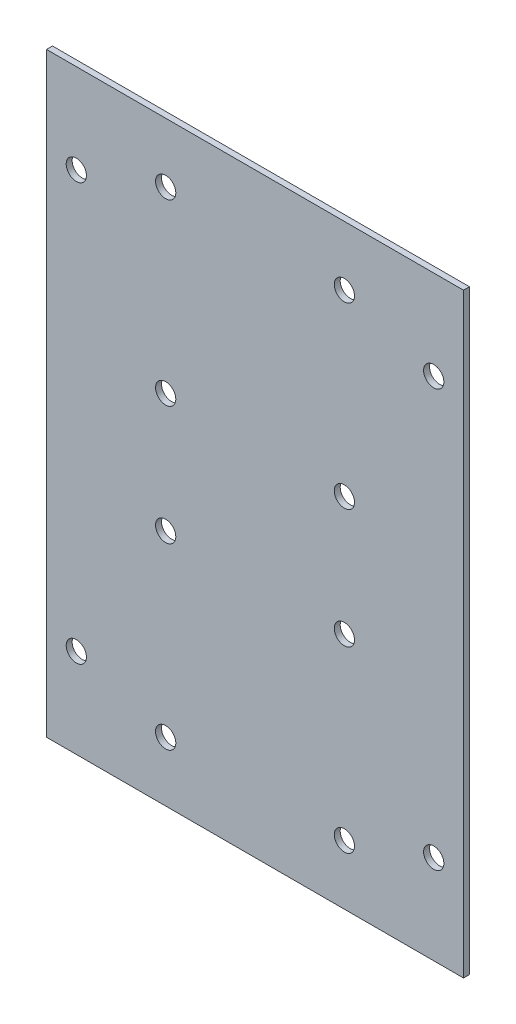
ISO-10303-21;
HEADER;
FILE_DESCRIPTION(('STEP AP214'),'2;1');
FILE_NAME('part.step','',(''),(''),'','','');
FILE_SCHEMA(('AUTOMOTIVE_DESIGN { 1 0 10303 214 1 1 1 1 }'));
ENDSEC;
DATA;
#1=APPLICATION_CONTEXT('core data for automotive mechanical design processes');
#2=APPLICATION_PROTOCOL_DEFINITION('international standard','automotive_design',2000,#1);
#3=PRODUCT_CONTEXT('',#1,'mechanical');
#4=PRODUCT('Part','Part','',(#3));
#5=PRODUCT_RELATED_PRODUCT_CATEGORY('part','',(#4));
#6=PRODUCT_DEFINITION_FORMATION('','',#4);
#7=PRODUCT_DEFINITION_CONTEXT('part definition',#1,'design');
#8=PRODUCT_DEFINITION('design','',#6,#7);
#9=PRODUCT_DEFINITION_SHAPE('','',#8);
#10=(LENGTH_UNIT() NAMED_UNIT(*) SI_UNIT(.MILLI.,.METRE.));
#11=(NAMED_UNIT(*) PLANE_ANGLE_UNIT() SI_UNIT($,.RADIAN.));
#12=(NAMED_UNIT(*) SI_UNIT($,.STERADIAN.) SOLID_ANGLE_UNIT());
#13=UNCERTAINTY_MEASURE_WITH_UNIT(LENGTH_MEASURE(1.E-05),#10,'distance_accuracy_value','');
#14=(GEOMETRIC_REPRESENTATION_CONTEXT(3) GLOBAL_UNCERTAINTY_ASSIGNED_CONTEXT((#13)) GLOBAL_UNIT_ASSIGNED_CONTEXT((#10,
#11,#12)) REPRESENTATION_CONTEXT('',''));
#15=CARTESIAN_POINT('',(0.,0.,0.));
#16=DIRECTION('',(0.,0.,1.));
#17=DIRECTION('',(1.,0.,0.));
#18=AXIS2_PLACEMENT_3D('',#15,#16,#17);
#19=CARTESIAN_POINT('',(0.,0.,0.));
#20=DIRECTION('',(0.,0.,-1.));
#21=DIRECTION('',(-1.,0.,0.));
#22=AXIS2_PLACEMENT_3D('',#19,#20,#21);
#23=PLANE('',#22);
#24=DIRECTION('',(0.,1.,0.));
#25=VECTOR('',#24,1.);
#26=CARTESIAN_POINT('',(35.,-50.,0.));
#27=LINE('',#26,#25);
#28=CARTESIAN_POINT('',(35.,-50.,0.));
#29=VERTEX_POINT('',#28);
#30=CARTESIAN_POINT('',(35.,50.,0.));
#31=VERTEX_POINT('',#30);
#32=EDGE_CURVE('E112',#29,#31,#27,.T.);
#33=ORIENTED_EDGE('',*,*,#32,.T.);
#34=DIRECTION('',(-1.,0.,0.));
#35=VECTOR('',#34,1.);
#36=CARTESIAN_POINT('',(-35.,50.,0.));
#37=LINE('',#36,#35);
#38=CARTESIAN_POINT('',(-35.,50.,0.));
#39=VERTEX_POINT('',#38);
#40=EDGE_CURVE('E111',#31,#39,#37,.T.);
#41=ORIENTED_EDGE('',*,*,#40,.T.);
#42=DIRECTION('',(0.,-1.,0.));
#43=VECTOR('',#42,1.);
#44=CARTESIAN_POINT('',(-35.,-50.,0.));
#45=LINE('',#44,#43);
#46=CARTESIAN_POINT('',(-35.,-50.,0.));
#47=VERTEX_POINT('',#46);
#48=EDGE_CURVE('E92',#39,#47,#45,.T.);
#49=ORIENTED_EDGE('',*,*,#48,.T.);
#50=DIRECTION('',(1.,0.,0.));
#51=VECTOR('',#50,1.);
#52=CARTESIAN_POINT('',(-35.,-50.,0.));
#53=LINE('',#52,#51);
#54=EDGE_CURVE('E106',#47,#29,#53,.T.);
#55=ORIENTED_EDGE('',*,*,#54,.T.);
#56=EDGE_LOOP('',(#33,#41,#49,#55));
#57=FACE_BOUND('',#56,.T.);
#58=CARTESIAN_POINT('',(-30.,-35.,1.2E-05));
#59=DIRECTION('',(0.,0.,1.));
#60=DIRECTION('',(1.,0.,0.));
#61=AXIS2_PLACEMENT_3D('',#58,#59,#60);
#62=CIRCLE('',#61,1.7);
#63=CARTESIAN_POINT('',(-28.3,-35.,1.2E-05));
#64=VERTEX_POINT('',#63);
#65=EDGE_CURVE('E113',#64,#64,#62,.T.);
#66=ORIENTED_EDGE('',*,*,#65,.F.);
#67=EDGE_LOOP('',(#66));
#68=FACE_BOUND('',#67,.T.);
#69=CARTESIAN_POINT('',(15.,40.,1.2E-05));
#70=DIRECTION('',(0.,0.,1.));
#71=DIRECTION('',(1.,0.,0.));
#72=AXIS2_PLACEMENT_3D('',#69,#70,#71);
#73=CIRCLE('',#72,1.7);
#74=CARTESIAN_POINT('',(16.7,40.,1.2E-05));
#75=VERTEX_POINT('',#74);
#76=EDGE_CURVE('E404',#75,#75,#73,.T.);
#77=ORIENTED_EDGE('',*,*,#76,.F.);
#78=EDGE_LOOP('',(#77));
#79=FACE_BOUND('',#78,.T.);
#80=CARTESIAN_POINT('',(15.,10.,1.2E-05));
#81=DIRECTION('',(0.,0.,1.));
#82=DIRECTION('',(1.,0.,0.));
#83=AXIS2_PLACEMENT_3D('',#80,#81,#82);
#84=CIRCLE('',#83,1.7);
#85=CARTESIAN_POINT('',(16.7,10.,1.2E-05));
#86=VERTEX_POINT('',#85);
#87=EDGE_CURVE('E401',#86,#86,#84,.T.);
#88=ORIENTED_EDGE('',*,*,#87,.F.);
#89=EDGE_LOOP('',(#88));
#90=FACE_BOUND('',#89,.T.);
#91=CARTESIAN_POINT('',(15.,-10.,1.2E-05));
#92=DIRECTION('',(0.,0.,1.));
#93=DIRECTION('',(1.,0.,0.));
#94=AXIS2_PLACEMENT_3D('',#91,#92,#93);
#95=CIRCLE('',#94,1.7);
#96=CARTESIAN_POINT('',(16.7,-10.,1.2E-05));
#97=VERTEX_POINT('',#96);
#98=EDGE_CURVE('E416',#97,#97,#95,.T.);
#99=ORIENTED_EDGE('',*,*,#98,.F.);
#100=EDGE_LOOP('',(#99));
#101=FACE_BOUND('',#100,.T.);
#102=CARTESIAN_POINT('',(-15.,-40.,1.2E-05));
#103=DIRECTION('',(0.,0.,1.));
#104=DIRECTION('',(1.,0.,0.));
#105=AXIS2_PLACEMENT_3D('',#102,#103,#104);
#106=CIRCLE('',#105,1.7);
#107=CARTESIAN_POINT('',(-13.3,-40.,1.2E-05));
#108=VERTEX_POINT('',#107);
#109=EDGE_CURVE('E220',#108,#108,#106,.T.);
#110=ORIENTED_EDGE('',*,*,#109,.F.);
#111=EDGE_LOOP('',(#110));
#112=FACE_BOUND('',#111,.T.);
#113=CARTESIAN_POINT('',(30.,35.,1.2E-05));
#114=DIRECTION('',(0.,0.,1.));
#115=DIRECTION('',(1.,0.,0.));
#116=AXIS2_PLACEMENT_3D('',#113,#114,#115);
#117=CIRCLE('',#116,1.7);
#118=CARTESIAN_POINT('',(31.7,35.,1.2E-05));
#119=VERTEX_POINT('',#118);
#120=EDGE_CURVE('E227',#119,#119,#117,.T.);
#121=ORIENTED_EDGE('',*,*,#120,.F.);
#122=EDGE_LOOP('',(#121));
#123=FACE_BOUND('',#122,.T.);
#124=CARTESIAN_POINT('',(30.,-35.,1.2E-05));
#125=DIRECTION('',(0.,0.,1.));
#126=DIRECTION('',(1.,0.,0.));
#127=AXIS2_PLACEMENT_3D('',#124,#125,#126);
#128=CIRCLE('',#127,1.7);
#129=CARTESIAN_POINT('',(31.7,-35.,1.2E-05));
#130=VERTEX_POINT('',#129);
#131=EDGE_CURVE('E228',#130,#130,#128,.T.);
#132=ORIENTED_EDGE('',*,*,#131,.F.);
#133=EDGE_LOOP('',(#132));
#134=FACE_BOUND('',#133,.T.);
#135=CARTESIAN_POINT('',(-30.,35.,1.2E-05));
#136=DIRECTION('',(0.,0.,1.));
#137=DIRECTION('',(1.,0.,0.));
#138=AXIS2_PLACEMENT_3D('',#135,#136,#137);
#139=CIRCLE('',#138,1.7);
#140=CARTESIAN_POINT('',(-28.3,35.,1.2E-05));
#141=VERTEX_POINT('',#140);
#142=EDGE_CURVE('E236',#141,#141,#139,.T.);
#143=ORIENTED_EDGE('',*,*,#142,.F.);
#144=EDGE_LOOP('',(#143));
#145=FACE_BOUND('',#144,.T.);
#146=CARTESIAN_POINT('',(15.,-40.,1.2E-05));
#147=DIRECTION('',(0.,0.,1.));
#148=DIRECTION('',(1.,0.,0.));
#149=AXIS2_PLACEMENT_3D('',#146,#147,#148);
#150=CIRCLE('',#149,1.7);
#151=CARTESIAN_POINT('',(16.7,-40.,1.2E-05));
#152=VERTEX_POINT('',#151);
#153=EDGE_CURVE('E414',#152,#152,#150,.T.);
#154=ORIENTED_EDGE('',*,*,#153,.F.);
#155=EDGE_LOOP('',(#154));
#156=FACE_BOUND('',#155,.T.);
#157=CARTESIAN_POINT('',(-15.,40.,1.2E-05));
#158=DIRECTION('',(0.,0.,1.));
#159=DIRECTION('',(1.,0.,0.));
#160=AXIS2_PLACEMENT_3D('',#157,#158,#159);
#161=CIRCLE('',#160,1.7);
#162=CARTESIAN_POINT('',(-13.3,40.,1.2E-05));
#163=VERTEX_POINT('',#162);
#164=EDGE_CURVE('E281',#163,#163,#161,.T.);
#165=ORIENTED_EDGE('',*,*,#164,.F.);
#166=EDGE_LOOP('',(#165));
#167=FACE_BOUND('',#166,.T.);
#168=CARTESIAN_POINT('',(-15.,10.,1.2E-05));
#169=DIRECTION('',(0.,0.,1.));
#170=DIRECTION('',(1.,0.,0.));
#171=AXIS2_PLACEMENT_3D('',#168,#169,#170);
#172=CIRCLE('',#171,1.7);
#173=CARTESIAN_POINT('',(-13.3,10.,1.2E-05));
#174=VERTEX_POINT('',#173);
#175=EDGE_CURVE('E199',#174,#174,#172,.T.);
#176=ORIENTED_EDGE('',*,*,#175,.F.);
#177=EDGE_LOOP('',(#176));
#178=FACE_BOUND('',#177,.T.);
#179=CARTESIAN_POINT('',(-15.,-10.,1.2E-05));
#180=DIRECTION('',(0.,0.,1.));
#181=DIRECTION('',(1.,0.,0.));
#182=AXIS2_PLACEMENT_3D('',#179,#180,#181);
#183=CIRCLE('',#182,1.7);
#184=CARTESIAN_POINT('',(-13.3,-10.,1.2E-05));
#185=VERTEX_POINT('',#184);
#186=EDGE_CURVE('E211',#185,#185,#183,.T.);
#187=ORIENTED_EDGE('',*,*,#186,.F.);
#188=EDGE_LOOP('',(#187));
#189=FACE_BOUND('',#188,.T.);
#190=ADVANCED_FACE('F41',(#57,#68,#79,#90,#101,#112,#123,#134,#145,#156,#167,#178,#189),#23,.F.);
#191=CARTESIAN_POINT('',(35.,-50.,-1.));
#192=DIRECTION('',(1.,0.,0.));
#193=DIRECTION('',(0.,0.,-1.));
#194=AXIS2_PLACEMENT_3D('',#191,#192,#193);
#195=PLANE('',#194);
#196=ORIENTED_EDGE('',*,*,#32,.F.);
#197=DIRECTION('',(0.,0.,1.));
#198=VECTOR('',#197,1.);
#199=CARTESIAN_POINT('',(35.,-50.,-1.));
#200=LINE('',#199,#198);
#201=CARTESIAN_POINT('',(35.,-50.,-1.));
#202=VERTEX_POINT('',#201);
#203=EDGE_CURVE('E11',#202,#29,#200,.T.);
#204=ORIENTED_EDGE('',*,*,#203,.F.);
#205=DIRECTION('',(0.,1.,0.));
#206=VECTOR('',#205,1.);
#207=CARTESIAN_POINT('',(35.,-50.,-1.));
#208=LINE('',#207,#206);
#209=CARTESIAN_POINT('',(35.,50.,-1.));
#210=VERTEX_POINT('',#209);
#211=EDGE_CURVE('E102',#202,#210,#208,.T.);
#212=ORIENTED_EDGE('',*,*,#211,.T.);
#213=DIRECTION('',(0.,0.,1.));
#214=VECTOR('',#213,1.);
#215=CARTESIAN_POINT('',(35.,50.,-1.));
#216=LINE('',#215,#214);
#217=EDGE_CURVE('E87',#210,#31,#216,.T.);
#218=ORIENTED_EDGE('',*,*,#217,.T.);
#219=EDGE_LOOP('',(#196,#204,#212,#218));
#220=FACE_BOUND('',#219,.T.);
#221=ADVANCED_FACE('F43',(#220),#195,.T.);
#222=CARTESIAN_POINT('',(-35.,-50.,-1.));
#223=DIRECTION('',(0.,-1.,0.));
#224=DIRECTION('',(0.,0.,-1.));
#225=AXIS2_PLACEMENT_3D('',#222,#223,#224);
#226=PLANE('',#225);
#227=ORIENTED_EDGE('',*,*,#54,.F.);
#228=DIRECTION('',(0.,0.,1.));
#229=VECTOR('',#228,1.);
#230=CARTESIAN_POINT('',(-35.,-50.,-1.));
#231=LINE('',#230,#229);
#232=CARTESIAN_POINT('',(-35.,-50.,-1.));
#233=VERTEX_POINT('',#232);
#234=EDGE_CURVE('E52',#233,#47,#231,.T.);
#235=ORIENTED_EDGE('',*,*,#234,.F.);
#236=DIRECTION('',(1.,0.,0.));
#237=VECTOR('',#236,1.);
#238=CARTESIAN_POINT('',(-35.,-50.,-1.));
#239=LINE('',#238,#237);
#240=EDGE_CURVE('E101',#233,#202,#239,.T.);
#241=ORIENTED_EDGE('',*,*,#240,.T.);
#242=ORIENTED_EDGE('',*,*,#203,.T.);
#243=EDGE_LOOP('',(#227,#235,#241,#242));
#244=FACE_BOUND('',#243,.T.);
#245=ADVANCED_FACE('F142',(#244),#226,.T.);
#246=CARTESIAN_POINT('',(-35.,-50.,-1.));
#247=DIRECTION('',(-1.,0.,0.));
#248=DIRECTION('',(0.,0.,1.));
#249=AXIS2_PLACEMENT_3D('',#246,#247,#248);
#250=PLANE('',#249);
#251=ORIENTED_EDGE('',*,*,#48,.F.);
#252=DIRECTION('',(0.,0.,1.));
#253=VECTOR('',#252,1.);
#254=CARTESIAN_POINT('',(-35.,50.,-1.));
#255=LINE('',#254,#253);
#256=CARTESIAN_POINT('',(-35.,50.,-1.));
#257=VERTEX_POINT('',#256);
#258=EDGE_CURVE('E89',#257,#39,#255,.T.);
#259=ORIENTED_EDGE('',*,*,#258,.F.);
#260=DIRECTION('',(0.,-1.,0.));
#261=VECTOR('',#260,1.);
#262=CARTESIAN_POINT('',(-35.,-50.,-1.));
#263=LINE('',#262,#261);
#264=EDGE_CURVE('E91',#257,#233,#263,.T.);
#265=ORIENTED_EDGE('',*,*,#264,.T.);
#266=ORIENTED_EDGE('',*,*,#234,.T.);
#267=EDGE_LOOP('',(#251,#259,#265,#266));
#268=FACE_BOUND('',#267,.T.);
#269=ADVANCED_FACE('F95',(#268),#250,.T.);
#270=CARTESIAN_POINT('',(-35.,50.,-1.));
#271=DIRECTION('',(0.,1.,0.));
#272=DIRECTION('',(0.,0.,1.));
#273=AXIS2_PLACEMENT_3D('',#270,#271,#272);
#274=PLANE('',#273);
#275=ORIENTED_EDGE('',*,*,#40,.F.);
#276=ORIENTED_EDGE('',*,*,#217,.F.);
#277=DIRECTION('',(-1.,0.,0.));
#278=VECTOR('',#277,1.);
#279=CARTESIAN_POINT('',(-35.,50.,-1.));
#280=LINE('',#279,#278);
#281=EDGE_CURVE('E99',#210,#257,#280,.T.);
#282=ORIENTED_EDGE('',*,*,#281,.T.);
#283=ORIENTED_EDGE('',*,*,#258,.T.);
#284=EDGE_LOOP('',(#275,#276,#282,#283));
#285=FACE_BOUND('',#284,.T.);
#286=ADVANCED_FACE('F103',(#285),#274,.T.);
#287=CARTESIAN_POINT('',(0.,0.,-1.));
#288=DIRECTION('',(0.,0.,-1.));
#289=DIRECTION('',(-1.,0.,0.));
#290=AXIS2_PLACEMENT_3D('',#287,#288,#289);
#291=PLANE('',#290);
#292=CARTESIAN_POINT('',(-15.,-10.,-1.));
#293=DIRECTION('',(0.,0.,1.));
#294=DIRECTION('',(1.,0.,0.));
#295=AXIS2_PLACEMENT_3D('',#292,#293,#294);
#296=CIRCLE('',#295,1.7);
#297=CARTESIAN_POINT('',(-13.3,-10.,-1.));
#298=VERTEX_POINT('',#297);
#299=EDGE_CURVE('E212',#298,#298,#296,.T.);
#300=ORIENTED_EDGE('',*,*,#299,.T.);
#301=EDGE_LOOP('',(#300));
#302=FACE_BOUND('',#301,.T.);
#303=CARTESIAN_POINT('',(-15.,10.,-1.));
#304=DIRECTION('',(0.,0.,1.));
#305=DIRECTION('',(1.,0.,0.));
#306=AXIS2_PLACEMENT_3D('',#303,#304,#305);
#307=CIRCLE('',#306,1.7);
#308=CARTESIAN_POINT('',(-13.3,10.,-1.));
#309=VERTEX_POINT('',#308);
#310=EDGE_CURVE('E214',#309,#309,#307,.T.);
#311=ORIENTED_EDGE('',*,*,#310,.T.);
#312=EDGE_LOOP('',(#311));
#313=FACE_BOUND('',#312,.T.);
#314=CARTESIAN_POINT('',(-15.,40.,-1.));
#315=DIRECTION('',(0.,0.,1.));
#316=DIRECTION('',(1.,0.,0.));
#317=AXIS2_PLACEMENT_3D('',#314,#315,#316);
#318=CIRCLE('',#317,1.7);
#319=CARTESIAN_POINT('',(-13.3,40.,-1.));
#320=VERTEX_POINT('',#319);
#321=EDGE_CURVE('E224',#320,#320,#318,.T.);
#322=ORIENTED_EDGE('',*,*,#321,.T.);
#323=EDGE_LOOP('',(#322));
#324=FACE_BOUND('',#323,.T.);
#325=CARTESIAN_POINT('',(15.,-40.,-1.));
#326=DIRECTION('',(0.,0.,1.));
#327=DIRECTION('',(1.,0.,0.));
#328=AXIS2_PLACEMENT_3D('',#325,#326,#327);
#329=CIRCLE('',#328,1.7);
#330=CARTESIAN_POINT('',(16.7,-40.,-1.));
#331=VERTEX_POINT('',#330);
#332=EDGE_CURVE('E412',#331,#331,#329,.T.);
#333=ORIENTED_EDGE('',*,*,#332,.T.);
#334=EDGE_LOOP('',(#333));
#335=FACE_BOUND('',#334,.T.);
#336=CARTESIAN_POINT('',(-30.,35.,-1.));
#337=DIRECTION('',(0.,0.,1.));
#338=DIRECTION('',(1.,0.,0.));
#339=AXIS2_PLACEMENT_3D('',#336,#337,#338);
#340=CIRCLE('',#339,1.7);
#341=CARTESIAN_POINT('',(-28.3,35.,-1.));
#342=VERTEX_POINT('',#341);
#343=EDGE_CURVE('E231',#342,#342,#340,.T.);
#344=ORIENTED_EDGE('',*,*,#343,.T.);
#345=EDGE_LOOP('',(#344));
#346=FACE_BOUND('',#345,.T.);
#347=CARTESIAN_POINT('',(30.,-35.,-1.));
#348=DIRECTION('',(0.,0.,1.));
#349=DIRECTION('',(1.,0.,0.));
#350=AXIS2_PLACEMENT_3D('',#347,#348,#349);
#351=CIRCLE('',#350,1.7);
#352=CARTESIAN_POINT('',(31.7,-35.,-1.));
#353=VERTEX_POINT('',#352);
#354=EDGE_CURVE('E239',#353,#353,#351,.T.);
#355=ORIENTED_EDGE('',*,*,#354,.T.);
#356=EDGE_LOOP('',(#355));
#357=FACE_BOUND('',#356,.T.);
#358=CARTESIAN_POINT('',(30.,35.,-1.));
#359=DIRECTION('',(0.,0.,1.));
#360=DIRECTION('',(1.,0.,0.));
#361=AXIS2_PLACEMENT_3D('',#358,#359,#360);
#362=CIRCLE('',#361,1.7);
#363=CARTESIAN_POINT('',(31.7,35.,-1.));
#364=VERTEX_POINT('',#363);
#365=EDGE_CURVE('E229',#364,#364,#362,.T.);
#366=ORIENTED_EDGE('',*,*,#365,.T.);
#367=EDGE_LOOP('',(#366));
#368=FACE_BOUND('',#367,.T.);
#369=CARTESIAN_POINT('',(-15.,-40.,-1.));
#370=DIRECTION('',(0.,0.,1.));
#371=DIRECTION('',(1.,0.,0.));
#372=AXIS2_PLACEMENT_3D('',#369,#370,#371);
#373=CIRCLE('',#372,1.7);
#374=CARTESIAN_POINT('',(-13.3,-40.,-1.));
#375=VERTEX_POINT('',#374);
#376=EDGE_CURVE('E232',#375,#375,#373,.T.);
#377=ORIENTED_EDGE('',*,*,#376,.T.);
#378=EDGE_LOOP('',(#377));
#379=FACE_BOUND('',#378,.T.);
#380=CARTESIAN_POINT('',(15.,-10.,-1.));
#381=DIRECTION('',(0.,0.,1.));
#382=DIRECTION('',(1.,0.,0.));
#383=AXIS2_PLACEMENT_3D('',#380,#381,#382);
#384=CIRCLE('',#383,1.7);
#385=CARTESIAN_POINT('',(16.7,-10.,-1.));
#386=VERTEX_POINT('',#385);
#387=EDGE_CURVE('E394',#386,#386,#384,.T.);
#388=ORIENTED_EDGE('',*,*,#387,.T.);
#389=EDGE_LOOP('',(#388));
#390=FACE_BOUND('',#389,.T.);
#391=CARTESIAN_POINT('',(15.,10.,-1.));
#392=DIRECTION('',(0.,0.,1.));
#393=DIRECTION('',(1.,0.,0.));
#394=AXIS2_PLACEMENT_3D('',#391,#392,#393);
#395=CIRCLE('',#394,1.7);
#396=CARTESIAN_POINT('',(16.7,10.,-1.));
#397=VERTEX_POINT('',#396);
#398=EDGE_CURVE('E392',#397,#397,#395,.T.);
#399=ORIENTED_EDGE('',*,*,#398,.T.);
#400=EDGE_LOOP('',(#399));
#401=FACE_BOUND('',#400,.T.);
#402=CARTESIAN_POINT('',(15.,40.,-1.));
#403=DIRECTION('',(0.,0.,1.));
#404=DIRECTION('',(1.,0.,0.));
#405=AXIS2_PLACEMENT_3D('',#402,#403,#404);
#406=CIRCLE('',#405,1.7);
#407=CARTESIAN_POINT('',(16.7,40.,-1.));
#408=VERTEX_POINT('',#407);
#409=EDGE_CURVE('E396',#408,#408,#406,.T.);
#410=ORIENTED_EDGE('',*,*,#409,.T.);
#411=EDGE_LOOP('',(#410));
#412=FACE_BOUND('',#411,.T.);
#413=CARTESIAN_POINT('',(-30.,-35.,-1.));
#414=DIRECTION('',(0.,0.,1.));
#415=DIRECTION('',(1.,0.,0.));
#416=AXIS2_PLACEMENT_3D('',#413,#414,#415);
#417=CIRCLE('',#416,1.7);
#418=CARTESIAN_POINT('',(-28.3,-35.,-1.));
#419=VERTEX_POINT('',#418);
#420=EDGE_CURVE('E240',#419,#419,#417,.T.);
#421=ORIENTED_EDGE('',*,*,#420,.T.);
#422=EDGE_LOOP('',(#421));
#423=FACE_BOUND('',#422,.T.);
#424=ORIENTED_EDGE('',*,*,#211,.F.);
#425=ORIENTED_EDGE('',*,*,#240,.F.);
#426=ORIENTED_EDGE('',*,*,#264,.F.);
#427=ORIENTED_EDGE('',*,*,#281,.F.);
#428=EDGE_LOOP('',(#424,#425,#426,#427));
#429=FACE_BOUND('',#428,.T.);
#430=ADVANCED_FACE('F97',(#302,#313,#324,#335,#346,#357,#368,#379,#390,#401,#412,#423,#429),
#291,.T.);
#431=CARTESIAN_POINT('',(-30.,-35.,1.2E-05));
#432=DIRECTION('',(0.,0.,-1.));
#433=DIRECTION('',(-1.,0.,0.));
#434=AXIS2_PLACEMENT_3D('',#431,#432,#433);
#435=CYLINDRICAL_SURFACE('',#434,1.7);
#436=ORIENTED_EDGE('',*,*,#65,.T.);
#437=EDGE_LOOP('',(#436));
#438=FACE_BOUND('',#437,.T.);
#439=ORIENTED_EDGE('',*,*,#420,.F.);
#440=EDGE_LOOP('',(#439));
#441=FACE_BOUND('',#440,.T.);
#442=ADVANCED_FACE('F302',(#438,#441),#435,.F.);
#443=CARTESIAN_POINT('',(15.,40.,1.2E-05));
#444=DIRECTION('',(0.,0.,-1.));
#445=DIRECTION('',(-1.,0.,0.));
#446=AXIS2_PLACEMENT_3D('',#443,#444,#445);
#447=CYLINDRICAL_SURFACE('',#446,1.7);
#448=ORIENTED_EDGE('',*,*,#76,.T.);
#449=EDGE_LOOP('',(#448));
#450=FACE_BOUND('',#449,.T.);
#451=ORIENTED_EDGE('',*,*,#409,.F.);
#452=EDGE_LOOP('',(#451));
#453=FACE_BOUND('',#452,.T.);
#454=ADVANCED_FACE('F299',(#450,#453),#447,.F.);
#455=CARTESIAN_POINT('',(15.,10.,1.2E-05));
#456=DIRECTION('',(0.,0.,-1.));
#457=DIRECTION('',(-1.,0.,0.));
#458=AXIS2_PLACEMENT_3D('',#455,#456,#457);
#459=CYLINDRICAL_SURFACE('',#458,1.7);
#460=ORIENTED_EDGE('',*,*,#87,.T.);
#461=EDGE_LOOP('',(#460));
#462=FACE_BOUND('',#461,.T.);
#463=ORIENTED_EDGE('',*,*,#398,.F.);
#464=EDGE_LOOP('',(#463));
#465=FACE_BOUND('',#464,.T.);
#466=ADVANCED_FACE('F297',(#462,#465),#459,.F.);
#467=CARTESIAN_POINT('',(15.,-10.,1.2E-05));
#468=DIRECTION('',(0.,0.,-1.));
#469=DIRECTION('',(-1.,0.,0.));
#470=AXIS2_PLACEMENT_3D('',#467,#468,#469);
#471=CYLINDRICAL_SURFACE('',#470,1.7);
#472=ORIENTED_EDGE('',*,*,#98,.T.);
#473=EDGE_LOOP('',(#472));
#474=FACE_BOUND('',#473,.T.);
#475=ORIENTED_EDGE('',*,*,#387,.F.);
#476=EDGE_LOOP('',(#475));
#477=FACE_BOUND('',#476,.T.);
#478=ADVANCED_FACE('F376',(#474,#477),#471,.F.);
#479=CARTESIAN_POINT('',(-15.,-40.,1.2E-05));
#480=DIRECTION('',(0.,0.,-1.));
#481=DIRECTION('',(-1.,0.,0.));
#482=AXIS2_PLACEMENT_3D('',#479,#480,#481);
#483=CYLINDRICAL_SURFACE('',#482,1.7);
#484=ORIENTED_EDGE('',*,*,#109,.T.);
#485=EDGE_LOOP('',(#484));
#486=FACE_BOUND('',#485,.T.);
#487=ORIENTED_EDGE('',*,*,#376,.F.);
#488=EDGE_LOOP('',(#487));
#489=FACE_BOUND('',#488,.T.);
#490=ADVANCED_FACE('F366',(#486,#489),#483,.F.);
#491=CARTESIAN_POINT('',(30.,35.,1.2E-05));
#492=DIRECTION('',(0.,0.,-1.));
#493=DIRECTION('',(-1.,0.,0.));
#494=AXIS2_PLACEMENT_3D('',#491,#492,#493);
#495=CYLINDRICAL_SURFACE('',#494,1.7);
#496=ORIENTED_EDGE('',*,*,#120,.T.);
#497=EDGE_LOOP('',(#496));
#498=FACE_BOUND('',#497,.T.);
#499=ORIENTED_EDGE('',*,*,#365,.F.);
#500=EDGE_LOOP('',(#499));
#501=FACE_BOUND('',#500,.T.);
#502=ADVANCED_FACE('F268',(#498,#501),#495,.F.);
#503=CARTESIAN_POINT('',(30.,-35.,1.2E-05));
#504=DIRECTION('',(0.,0.,-1.));
#505=DIRECTION('',(-1.,0.,0.));
#506=AXIS2_PLACEMENT_3D('',#503,#504,#505);
#507=CYLINDRICAL_SURFACE('',#506,1.7);
#508=ORIENTED_EDGE('',*,*,#131,.T.);
#509=EDGE_LOOP('',(#508));
#510=FACE_BOUND('',#509,.T.);
#511=ORIENTED_EDGE('',*,*,#354,.F.);
#512=EDGE_LOOP('',(#511));
#513=FACE_BOUND('',#512,.T.);
#514=ADVANCED_FACE('F327',(#510,#513),#507,.F.);
#515=CARTESIAN_POINT('',(-30.,35.,1.2E-05));
#516=DIRECTION('',(0.,0.,-1.));
#517=DIRECTION('',(-1.,0.,0.));
#518=AXIS2_PLACEMENT_3D('',#515,#516,#517);
#519=CYLINDRICAL_SURFACE('',#518,1.7);
#520=ORIENTED_EDGE('',*,*,#142,.T.);
#521=EDGE_LOOP('',(#520));
#522=FACE_BOUND('',#521,.T.);
#523=ORIENTED_EDGE('',*,*,#343,.F.);
#524=EDGE_LOOP('',(#523));
#525=FACE_BOUND('',#524,.T.);
#526=ADVANCED_FACE('F335',(#522,#525),#519,.F.);
#527=CARTESIAN_POINT('',(15.,-40.,1.2E-05));
#528=DIRECTION('',(0.,0.,-1.));
#529=DIRECTION('',(-1.,0.,0.));
#530=AXIS2_PLACEMENT_3D('',#527,#528,#529);
#531=CYLINDRICAL_SURFACE('',#530,1.7);
#532=ORIENTED_EDGE('',*,*,#153,.T.);
#533=EDGE_LOOP('',(#532));
#534=FACE_BOUND('',#533,.T.);
#535=ORIENTED_EDGE('',*,*,#332,.F.);
#536=EDGE_LOOP('',(#535));
#537=FACE_BOUND('',#536,.T.);
#538=ADVANCED_FACE('F257',(#534,#537),#531,.F.);
#539=CARTESIAN_POINT('',(-15.,40.,1.2E-05));
#540=DIRECTION('',(0.,0.,-1.));
#541=DIRECTION('',(-1.,0.,0.));
#542=AXIS2_PLACEMENT_3D('',#539,#540,#541);
#543=CYLINDRICAL_SURFACE('',#542,1.7);
#544=ORIENTED_EDGE('',*,*,#164,.T.);
#545=EDGE_LOOP('',(#544));
#546=FACE_BOUND('',#545,.T.);
#547=ORIENTED_EDGE('',*,*,#321,.F.);
#548=EDGE_LOOP('',(#547));
#549=FACE_BOUND('',#548,.T.);
#550=ADVANCED_FACE('F266',(#546,#549),#543,.F.);
#551=CARTESIAN_POINT('',(-15.,10.,1.2E-05));
#552=DIRECTION('',(0.,0.,-1.));
#553=DIRECTION('',(-1.,0.,0.));
#554=AXIS2_PLACEMENT_3D('',#551,#552,#553);
#555=CYLINDRICAL_SURFACE('',#554,1.7);
#556=ORIENTED_EDGE('',*,*,#175,.T.);
#557=EDGE_LOOP('',(#556));
#558=FACE_BOUND('',#557,.T.);
#559=ORIENTED_EDGE('',*,*,#310,.F.);
#560=EDGE_LOOP('',(#559));
#561=FACE_BOUND('',#560,.T.);
#562=ADVANCED_FACE('F259',(#558,#561),#555,.F.);
#563=CARTESIAN_POINT('',(-15.,-10.,1.2E-05));
#564=DIRECTION('',(0.,0.,-1.));
#565=DIRECTION('',(-1.,0.,0.));
#566=AXIS2_PLACEMENT_3D('',#563,#564,#565);
#567=CYLINDRICAL_SURFACE('',#566,1.7);
#568=ORIENTED_EDGE('',*,*,#186,.T.);
#569=EDGE_LOOP('',(#568));
#570=FACE_BOUND('',#569,.T.);
#571=ORIENTED_EDGE('',*,*,#299,.F.);
#572=EDGE_LOOP('',(#571));
#573=FACE_BOUND('',#572,.T.);
#574=ADVANCED_FACE('F246',(#570,#573),#567,.F.);
#575=CLOSED_SHELL('',(#190,#221,#245,#269,#286,#430,#442,#454,#466,#478,#490,#502,#514,#526,
#538,#550,#562,#574));
#576=MANIFOLD_SOLID_BREP('B2',#575);
#577=ADVANCED_BREP_SHAPE_REPRESENTATION('',(#18,#576),#14);
#578=SHAPE_DEFINITION_REPRESENTATION(#9,#577);
ENDSEC;
END-ISO-10303-21;
